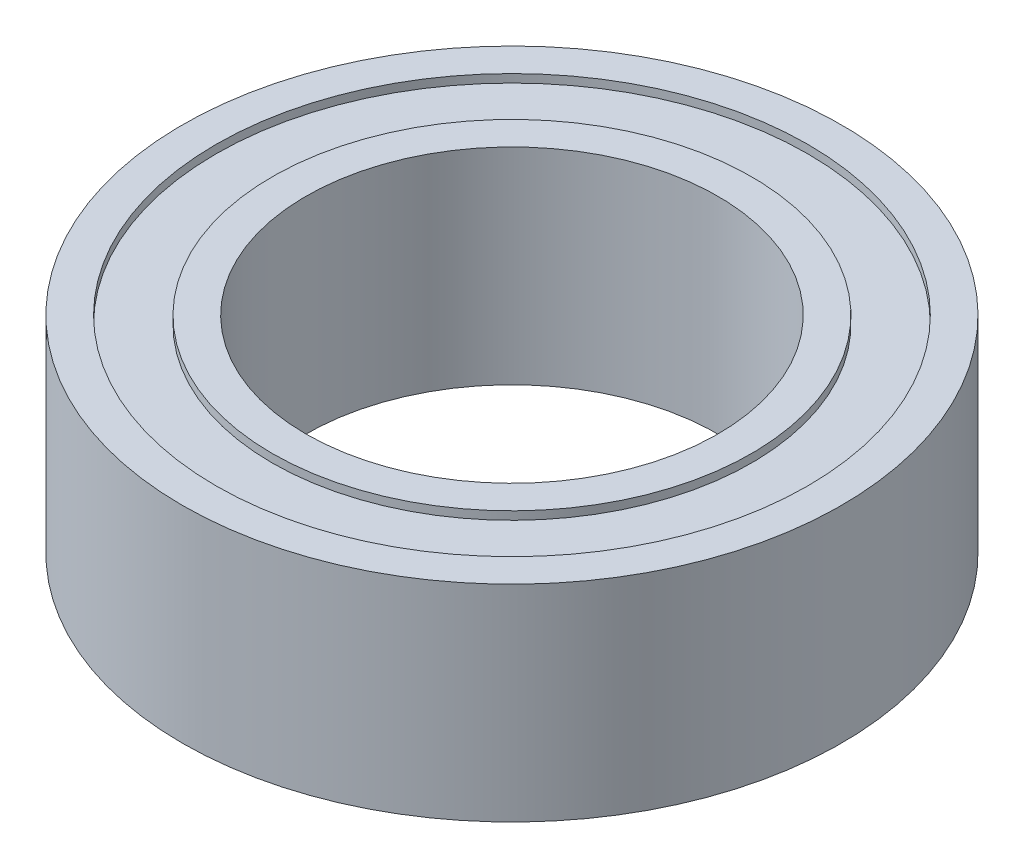
ISO-10303-21;
HEADER;
FILE_DESCRIPTION(('STEP AP214'),'2;1');
FILE_NAME('part.step','',(''),(''),'','','');
FILE_SCHEMA(('AUTOMOTIVE_DESIGN { 1 0 10303 214 1 1 1 1 }'));
ENDSEC;
DATA;
#1=APPLICATION_CONTEXT('core data for automotive mechanical design processes');
#2=APPLICATION_PROTOCOL_DEFINITION('international standard','automotive_design',2000,#1);
#3=PRODUCT_CONTEXT('',#1,'mechanical');
#4=PRODUCT('Part','Part','',(#3));
#5=PRODUCT_RELATED_PRODUCT_CATEGORY('part','',(#4));
#6=PRODUCT_DEFINITION_FORMATION('','',#4);
#7=PRODUCT_DEFINITION_CONTEXT('part definition',#1,'design');
#8=PRODUCT_DEFINITION('design','',#6,#7);
#9=PRODUCT_DEFINITION_SHAPE('','',#8);
#10=(LENGTH_UNIT() NAMED_UNIT(*) SI_UNIT(.MILLI.,.METRE.));
#11=(NAMED_UNIT(*) PLANE_ANGLE_UNIT() SI_UNIT($,.RADIAN.));
#12=(NAMED_UNIT(*) SI_UNIT($,.STERADIAN.) SOLID_ANGLE_UNIT());
#13=UNCERTAINTY_MEASURE_WITH_UNIT(LENGTH_MEASURE(1.E-05),#10,'distance_accuracy_value','');
#14=(GEOMETRIC_REPRESENTATION_CONTEXT(3) GLOBAL_UNCERTAINTY_ASSIGNED_CONTEXT((#13)) GLOBAL_UNIT_ASSIGNED_CONTEXT((#10,
#11,#12)) REPRESENTATION_CONTEXT('',''));
#15=CARTESIAN_POINT('',(0.,0.,0.));
#16=DIRECTION('',(0.,0.,1.));
#17=DIRECTION('',(1.,0.,0.));
#18=AXIS2_PLACEMENT_3D('',#15,#16,#17);
#19=CARTESIAN_POINT('',(0.,1.25,0.));
#20=DIRECTION('',(0.,1.,0.));
#21=DIRECTION('',(0.,0.,1.));
#22=AXIS2_PLACEMENT_3D('',#19,#20,#21);
#23=PLANE('',#22);
#24=CARTESIAN_POINT('',(0.,1.25,0.));
#25=DIRECTION('',(0.,1.,0.));
#26=DIRECTION('',(0.,0.,1.));
#27=AXIS2_PLACEMENT_3D('',#24,#25,#26);
#28=CIRCLE('',#27,2.5);
#29=CARTESIAN_POINT('',(0.,1.25,2.5));
#30=VERTEX_POINT('',#29);
#31=EDGE_CURVE('E55',#30,#30,#28,.T.);
#32=ORIENTED_EDGE('',*,*,#31,.F.);
#33=EDGE_LOOP('',(#32));
#34=FACE_BOUND('',#33,.T.);
#35=CARTESIAN_POINT('',(0.,1.25,0.));
#36=DIRECTION('',(0.,1.,0.));
#37=DIRECTION('',(0.,0.,1.));
#38=AXIS2_PLACEMENT_3D('',#35,#36,#37);
#39=CIRCLE('',#38,2.90919294497139);
#40=CARTESIAN_POINT('',(0.,1.25,2.90919294497139));
#41=VERTEX_POINT('',#40);
#42=EDGE_CURVE('E68',#41,#41,#39,.T.);
#43=ORIENTED_EDGE('',*,*,#42,.T.);
#44=EDGE_LOOP('',(#43));
#45=FACE_BOUND('',#44,.T.);
#46=ADVANCED_FACE('F44',(#34,#45),#23,.T.);
#47=CARTESIAN_POINT('',(0.,1.25,0.));
#48=DIRECTION('',(0.,1.,0.));
#49=DIRECTION('',(0.,0.,1.));
#50=AXIS2_PLACEMENT_3D('',#47,#48,#49);
#51=CIRCLE('',#50,3.59080705502861);
#52=CARTESIAN_POINT('',(0.,1.25,3.59080705502861));
#53=VERTEX_POINT('',#52);
#54=EDGE_CURVE('E58',#53,#53,#51,.T.);
#55=ORIENTED_EDGE('',*,*,#54,.F.);
#56=EDGE_LOOP('',(#55));
#57=FACE_BOUND('',#56,.T.);
#58=CARTESIAN_POINT('',(0.,1.25,0.));
#59=DIRECTION('',(0.,1.,0.));
#60=DIRECTION('',(0.,0.,1.));
#61=AXIS2_PLACEMENT_3D('',#58,#59,#60);
#62=CIRCLE('',#61,4.);
#63=CARTESIAN_POINT('',(0.,1.25,4.));
#64=VERTEX_POINT('',#63);
#65=EDGE_CURVE('E10',#64,#64,#62,.T.);
#66=ORIENTED_EDGE('',*,*,#65,.T.);
#67=EDGE_LOOP('',(#66));
#68=FACE_BOUND('',#67,.T.);
#69=ADVANCED_FACE('F119',(#57,#68),#23,.T.);
#70=CARTESIAN_POINT('',(0.,1.25,0.));
#71=DIRECTION('',(0.,-1.,0.));
#72=DIRECTION('',(0.,0.,-1.));
#73=AXIS2_PLACEMENT_3D('',#70,#71,#72);
#74=CYLINDRICAL_SURFACE('',#73,4.);
#75=ORIENTED_EDGE('',*,*,#65,.F.);
#76=EDGE_LOOP('',(#75));
#77=FACE_BOUND('',#76,.T.);
#78=CARTESIAN_POINT('',(0.,-1.25,0.));
#79=DIRECTION('',(0.,1.,0.));
#80=DIRECTION('',(0.,0.,1.));
#81=AXIS2_PLACEMENT_3D('',#78,#79,#80);
#82=CIRCLE('',#81,4.);
#83=CARTESIAN_POINT('',(0.,-1.25,4.));
#84=VERTEX_POINT('',#83);
#85=EDGE_CURVE('E69',#84,#84,#82,.T.);
#86=ORIENTED_EDGE('',*,*,#85,.T.);
#87=EDGE_LOOP('',(#86));
#88=FACE_BOUND('',#87,.T.);
#89=ADVANCED_FACE('F50',(#77,#88),#74,.T.);
#90=CARTESIAN_POINT('',(0.,1.25,0.));
#91=DIRECTION('',(0.,-1.,0.));
#92=DIRECTION('',(0.,0.,-1.));
#93=AXIS2_PLACEMENT_3D('',#90,#91,#92);
#94=CYLINDRICAL_SURFACE('',#93,2.5);
#95=ORIENTED_EDGE('',*,*,#31,.T.);
#96=EDGE_LOOP('',(#95));
#97=FACE_BOUND('',#96,.T.);
#98=CARTESIAN_POINT('',(0.,-1.25,0.));
#99=DIRECTION('',(0.,1.,0.));
#100=DIRECTION('',(0.,0.,1.));
#101=AXIS2_PLACEMENT_3D('',#98,#99,#100);
#102=CIRCLE('',#101,2.5);
#103=CARTESIAN_POINT('',(0.,-1.25,2.5));
#104=VERTEX_POINT('',#103);
#105=EDGE_CURVE('E74',#104,#104,#102,.T.);
#106=ORIENTED_EDGE('',*,*,#105,.F.);
#107=EDGE_LOOP('',(#106));
#108=FACE_BOUND('',#107,.T.);
#109=ADVANCED_FACE('F126',(#97,#108),#94,.F.);
#110=CARTESIAN_POINT('',(0.,1.15,0.));
#111=DIRECTION('',(0.,1.,0.));
#112=DIRECTION('',(0.,0.,1.));
#113=AXIS2_PLACEMENT_3D('',#110,#111,#112);
#114=CYLINDRICAL_SURFACE('',#113,3.59080705502861);
#115=CARTESIAN_POINT('',(0.,1.15,0.));
#116=DIRECTION('',(0.,1.,0.));
#117=DIRECTION('',(0.,0.,1.));
#118=AXIS2_PLACEMENT_3D('',#115,#116,#117);
#119=CIRCLE('',#118,3.59080705502861);
#120=CARTESIAN_POINT('',(0.,1.15,3.59080705502861));
#121=VERTEX_POINT('',#120);
#122=EDGE_CURVE('E57',#121,#121,#119,.T.);
#123=ORIENTED_EDGE('',*,*,#122,.F.);
#124=EDGE_LOOP('',(#123));
#125=FACE_BOUND('',#124,.T.);
#126=ORIENTED_EDGE('',*,*,#54,.T.);
#127=EDGE_LOOP('',(#126));
#128=FACE_BOUND('',#127,.T.);
#129=ADVANCED_FACE('F128',(#125,#128),#114,.F.);
#130=CARTESIAN_POINT('',(0.,1.15,0.));
#131=DIRECTION('',(0.,1.,0.));
#132=DIRECTION('',(0.,0.,1.));
#133=AXIS2_PLACEMENT_3D('',#130,#131,#132);
#134=PLANE('',#133);
#135=CARTESIAN_POINT('',(0.,1.15,0.));
#136=DIRECTION('',(0.,1.,0.));
#137=DIRECTION('',(0.,0.,1.));
#138=AXIS2_PLACEMENT_3D('',#135,#136,#137);
#139=CIRCLE('',#138,2.90919294497139);
#140=CARTESIAN_POINT('',(0.,1.15,2.90919294497139));
#141=VERTEX_POINT('',#140);
#142=EDGE_CURVE('E65',#141,#141,#139,.T.);
#143=ORIENTED_EDGE('',*,*,#142,.F.);
#144=EDGE_LOOP('',(#143));
#145=FACE_BOUND('',#144,.T.);
#146=ORIENTED_EDGE('',*,*,#122,.T.);
#147=EDGE_LOOP('',(#146));
#148=FACE_BOUND('',#147,.T.);
#149=ADVANCED_FACE('F115',(#145,#148),#134,.T.);
#150=CARTESIAN_POINT('',(0.,1.15,0.));
#151=DIRECTION('',(0.,1.,0.));
#152=DIRECTION('',(0.,0.,1.));
#153=AXIS2_PLACEMENT_3D('',#150,#151,#152);
#154=CYLINDRICAL_SURFACE('',#153,2.90919294497139);
#155=ORIENTED_EDGE('',*,*,#142,.T.);
#156=EDGE_LOOP('',(#155));
#157=FACE_BOUND('',#156,.T.);
#158=ORIENTED_EDGE('',*,*,#42,.F.);
#159=EDGE_LOOP('',(#158));
#160=FACE_BOUND('',#159,.T.);
#161=ADVANCED_FACE('F105',(#157,#160),#154,.T.);
#162=CARTESIAN_POINT('',(0.,-1.25,0.));
#163=DIRECTION('',(0.,-1.,0.));
#164=DIRECTION('',(0.,0.,1.));
#165=AXIS2_PLACEMENT_3D('',#162,#163,#164);
#166=PLANE('',#165);
#167=ORIENTED_EDGE('',*,*,#105,.T.);
#168=EDGE_LOOP('',(#167));
#169=FACE_BOUND('',#168,.T.);
#170=CARTESIAN_POINT('',(0.,-1.25,0.));
#171=DIRECTION('',(0.,1.,0.));
#172=DIRECTION('',(0.,0.,1.));
#173=AXIS2_PLACEMENT_3D('',#170,#171,#172);
#174=CIRCLE('',#173,2.90919294497139);
#175=CARTESIAN_POINT('',(0.,-1.25,2.90919294497139));
#176=VERTEX_POINT('',#175);
#177=EDGE_CURVE('E84',#176,#176,#174,.T.);
#178=ORIENTED_EDGE('',*,*,#177,.F.);
#179=EDGE_LOOP('',(#178));
#180=FACE_BOUND('',#179,.T.);
#181=ADVANCED_FACE('F97',(#169,#180),#166,.T.);
#182=CARTESIAN_POINT('',(0.,-1.25,0.));
#183=DIRECTION('',(0.,1.,0.));
#184=DIRECTION('',(0.,0.,1.));
#185=AXIS2_PLACEMENT_3D('',#182,#183,#184);
#186=CIRCLE('',#185,3.59080705502861);
#187=CARTESIAN_POINT('',(0.,-1.25,3.59080705502861));
#188=VERTEX_POINT('',#187);
#189=EDGE_CURVE('E77',#188,#188,#186,.T.);
#190=ORIENTED_EDGE('',*,*,#189,.T.);
#191=EDGE_LOOP('',(#190));
#192=FACE_BOUND('',#191,.T.);
#193=ORIENTED_EDGE('',*,*,#85,.F.);
#194=EDGE_LOOP('',(#193));
#195=FACE_BOUND('',#194,.T.);
#196=ADVANCED_FACE('F101',(#192,#195),#166,.T.);
#197=CARTESIAN_POINT('',(0.,-1.15,0.));
#198=DIRECTION('',(0.,-1.,0.));
#199=DIRECTION('',(0.,0.,1.));
#200=AXIS2_PLACEMENT_3D('',#197,#198,#199);
#201=CYLINDRICAL_SURFACE('',#200,3.59080705502861);
#202=CARTESIAN_POINT('',(0.,-1.15,0.));
#203=DIRECTION('',(0.,1.,0.));
#204=DIRECTION('',(0.,0.,1.));
#205=AXIS2_PLACEMENT_3D('',#202,#203,#204);
#206=CIRCLE('',#205,3.59080705502861);
#207=CARTESIAN_POINT('',(0.,-1.15,3.59080705502861));
#208=VERTEX_POINT('',#207);
#209=EDGE_CURVE('E79',#208,#208,#206,.T.);
#210=ORIENTED_EDGE('',*,*,#209,.T.);
#211=EDGE_LOOP('',(#210));
#212=FACE_BOUND('',#211,.T.);
#213=ORIENTED_EDGE('',*,*,#189,.F.);
#214=EDGE_LOOP('',(#213));
#215=FACE_BOUND('',#214,.T.);
#216=ADVANCED_FACE('F108',(#212,#215),#201,.F.);
#217=CARTESIAN_POINT('',(0.,-1.15,0.));
#218=DIRECTION('',(0.,-1.,0.));
#219=DIRECTION('',(0.,0.,1.));
#220=AXIS2_PLACEMENT_3D('',#217,#218,#219);
#221=PLANE('',#220);
#222=CARTESIAN_POINT('',(0.,-1.15,0.));
#223=DIRECTION('',(0.,1.,0.));
#224=DIRECTION('',(0.,0.,1.));
#225=AXIS2_PLACEMENT_3D('',#222,#223,#224);
#226=CIRCLE('',#225,2.90919294497139);
#227=CARTESIAN_POINT('',(0.,-1.15,2.90919294497139));
#228=VERTEX_POINT('',#227);
#229=EDGE_CURVE('E83',#228,#228,#226,.T.);
#230=ORIENTED_EDGE('',*,*,#229,.T.);
#231=EDGE_LOOP('',(#230));
#232=FACE_BOUND('',#231,.T.);
#233=ORIENTED_EDGE('',*,*,#209,.F.);
#234=EDGE_LOOP('',(#233));
#235=FACE_BOUND('',#234,.T.);
#236=ADVANCED_FACE('F89',(#232,#235),#221,.T.);
#237=CARTESIAN_POINT('',(0.,-1.15,0.));
#238=DIRECTION('',(0.,-1.,0.));
#239=DIRECTION('',(0.,0.,1.));
#240=AXIS2_PLACEMENT_3D('',#237,#238,#239);
#241=CYLINDRICAL_SURFACE('',#240,2.90919294497139);
#242=ORIENTED_EDGE('',*,*,#229,.F.);
#243=EDGE_LOOP('',(#242));
#244=FACE_BOUND('',#243,.T.);
#245=ORIENTED_EDGE('',*,*,#177,.T.);
#246=EDGE_LOOP('',(#245));
#247=FACE_BOUND('',#246,.T.);
#248=ADVANCED_FACE('F91',(#244,#247),#241,.T.);
#249=CLOSED_SHELL('',(#46,#69,#89,#109,#129,#149,#161,#181,#196,#216,#236,#248));
#250=MANIFOLD_SOLID_BREP('B2',#249);
#251=ADVANCED_BREP_SHAPE_REPRESENTATION('',(#18,#250),#14);
#252=SHAPE_DEFINITION_REPRESENTATION(#9,#251);
ENDSEC;
END-ISO-10303-21;
